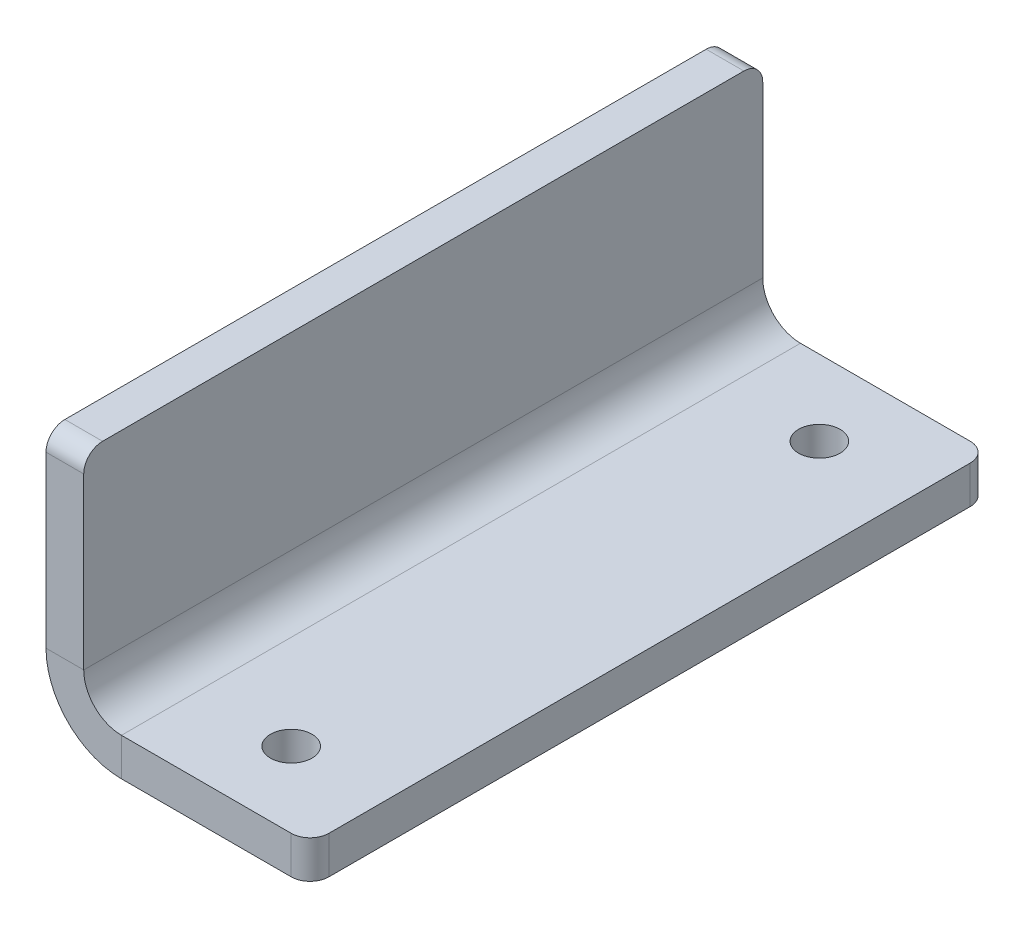
ISO-10303-21;
HEADER;
FILE_DESCRIPTION(('STEP AP214'),'2;1');
FILE_NAME('part.step','',(''),(''),'','','');
FILE_SCHEMA(('AUTOMOTIVE_DESIGN { 1 0 10303 214 1 1 1 1 }'));
ENDSEC;
DATA;
#1=APPLICATION_CONTEXT('core data for automotive mechanical design processes');
#2=APPLICATION_PROTOCOL_DEFINITION('international standard','automotive_design',2000,#1);
#3=PRODUCT_CONTEXT('',#1,'mechanical');
#4=PRODUCT('Part','Part','',(#3));
#5=PRODUCT_RELATED_PRODUCT_CATEGORY('part','',(#4));
#6=PRODUCT_DEFINITION_FORMATION('','',#4);
#7=PRODUCT_DEFINITION_CONTEXT('part definition',#1,'design');
#8=PRODUCT_DEFINITION('design','',#6,#7);
#9=PRODUCT_DEFINITION_SHAPE('','',#8);
#10=(LENGTH_UNIT() NAMED_UNIT(*) SI_UNIT(.MILLI.,.METRE.));
#11=(NAMED_UNIT(*) PLANE_ANGLE_UNIT() SI_UNIT($,.RADIAN.));
#12=(NAMED_UNIT(*) SI_UNIT($,.STERADIAN.) SOLID_ANGLE_UNIT());
#13=UNCERTAINTY_MEASURE_WITH_UNIT(LENGTH_MEASURE(1.E-05),#10,'distance_accuracy_value','');
#14=(GEOMETRIC_REPRESENTATION_CONTEXT(3) GLOBAL_UNCERTAINTY_ASSIGNED_CONTEXT((#13)) GLOBAL_UNIT_ASSIGNED_CONTEXT((#10,
#11,#12)) REPRESENTATION_CONTEXT('',''));
#15=CARTESIAN_POINT('',(0.,0.,0.));
#16=DIRECTION('',(0.,0.,1.));
#17=DIRECTION('',(1.,0.,0.));
#18=AXIS2_PLACEMENT_3D('',#15,#16,#17);
#19=CARTESIAN_POINT('',(10.,0.,180.));
#20=DIRECTION('',(0.,0.,1.));
#21=DIRECTION('',(1.,0.,0.));
#22=AXIS2_PLACEMENT_3D('',#19,#20,#21);
#23=PLANE('',#22);
#24=DIRECTION('',(0.,-1.,0.));
#25=VECTOR('',#24,1.);
#26=CARTESIAN_POINT('',(10.,0.,180.));
#27=LINE('',#26,#25);
#28=CARTESIAN_POINT('',(10.,0.,180.));
#29=VERTEX_POINT('',#28);
#30=CARTESIAN_POINT('',(10.,-10.,180.));
#31=VERTEX_POINT('',#30);
#32=EDGE_CURVE('E136',#29,#31,#27,.T.);
#33=ORIENTED_EDGE('',*,*,#32,.F.);
#34=CARTESIAN_POINT('',(10.,10.,180.));
#35=DIRECTION('',(0.,0.,-1.));
#36=DIRECTION('',(-1.,0.,0.));
#37=AXIS2_PLACEMENT_3D('',#34,#35,#36);
#38=CIRCLE('',#37,10.);
#39=CARTESIAN_POINT('',(0.,10.,180.));
#40=VERTEX_POINT('',#39);
#41=EDGE_CURVE('E140',#40,#29,#38,.F.);
#42=ORIENTED_EDGE('',*,*,#41,.F.);
#43=DIRECTION('',(1.,0.,0.));
#44=VECTOR('',#43,1.);
#45=CARTESIAN_POINT('',(-10.,10.,180.));
#46=LINE('',#45,#44);
#47=CARTESIAN_POINT('',(-10.,10.,180.));
#48=VERTEX_POINT('',#47);
#49=EDGE_CURVE('E146',#48,#40,#46,.T.);
#50=ORIENTED_EDGE('',*,*,#49,.F.);
#51=CARTESIAN_POINT('',(10.,10.,180.));
#52=DIRECTION('',(0.,0.,1.));
#53=DIRECTION('',(1.,0.,0.));
#54=AXIS2_PLACEMENT_3D('',#51,#52,#53);
#55=CIRCLE('',#54,20.);
#56=EDGE_CURVE('E142',#48,#31,#55,.T.);
#57=ORIENTED_EDGE('',*,*,#56,.T.);
#58=EDGE_LOOP('',(#33,#42,#50,#57));
#59=FACE_BOUND('',#58,.T.);
#60=ADVANCED_FACE('F40',(#59),#23,.T.);
#61=CARTESIAN_POINT('',(-10.,10.,180.));
#62=DIRECTION('',(0.,0.,1.));
#63=DIRECTION('',(1.,0.,0.));
#64=AXIS2_PLACEMENT_3D('',#61,#62,#63);
#65=PLANE('',#64);
#66=DIRECTION('',(1.,0.,0.));
#67=VECTOR('',#66,1.);
#68=CARTESIAN_POINT('',(0.,-10.,180.));
#69=LINE('',#68,#67);
#70=CARTESIAN_POINT('',(55.,-10.,180.));
#71=VERTEX_POINT('',#70);
#72=EDGE_CURVE('E163',#31,#71,#69,.T.);
#73=ORIENTED_EDGE('',*,*,#72,.T.);
#74=DIRECTION('',(0.,-1.,0.));
#75=VECTOR('',#74,1.);
#76=CARTESIAN_POINT('',(55.,10.,180.));
#77=LINE('',#76,#75);
#78=CARTESIAN_POINT('',(55.,0.,180.));
#79=VERTEX_POINT('',#78);
#80=EDGE_CURVE('E66',#71,#79,#77,.F.);
#81=ORIENTED_EDGE('',*,*,#80,.T.);
#82=DIRECTION('',(1.,0.,0.));
#83=VECTOR('',#82,1.);
#84=CARTESIAN_POINT('',(0.,0.,180.));
#85=LINE('',#84,#83);
#86=EDGE_CURVE('E151',#29,#79,#85,.T.);
#87=ORIENTED_EDGE('',*,*,#86,.F.);
#88=ORIENTED_EDGE('',*,*,#32,.T.);
#89=EDGE_LOOP('',(#73,#81,#87,#88));
#90=FACE_BOUND('',#89,.T.);
#91=ADVANCED_FACE('F161',(#90),#65,.T.);
#92=CARTESIAN_POINT('',(0.,10.,0.));
#93=DIRECTION('',(0.,0.,-1.));
#94=DIRECTION('',(-1.,0.,0.));
#95=AXIS2_PLACEMENT_3D('',#92,#93,#94);
#96=PLANE('',#95);
#97=DIRECTION('',(-1.,0.,0.));
#98=VECTOR('',#97,1.);
#99=CARTESIAN_POINT('',(0.,10.,0.));
#100=LINE('',#99,#98);
#101=CARTESIAN_POINT('',(0.,10.,0.));
#102=VERTEX_POINT('',#101);
#103=CARTESIAN_POINT('',(-10.,10.,0.));
#104=VERTEX_POINT('',#103);
#105=EDGE_CURVE('E227',#102,#104,#100,.T.);
#106=ORIENTED_EDGE('',*,*,#105,.F.);
#107=CARTESIAN_POINT('',(10.,10.,0.));
#108=DIRECTION('',(0.,0.,-1.));
#109=DIRECTION('',(-1.,0.,0.));
#110=AXIS2_PLACEMENT_3D('',#107,#108,#109);
#111=CIRCLE('',#110,10.);
#112=CARTESIAN_POINT('',(10.,0.,0.));
#113=VERTEX_POINT('',#112);
#114=EDGE_CURVE('E188',#102,#113,#111,.F.);
#115=ORIENTED_EDGE('',*,*,#114,.T.);
#116=DIRECTION('',(0.,1.,0.));
#117=VECTOR('',#116,1.);
#118=CARTESIAN_POINT('',(10.,-10.,0.));
#119=LINE('',#118,#117);
#120=CARTESIAN_POINT('',(10.,-10.,0.));
#121=VERTEX_POINT('',#120);
#122=EDGE_CURVE('E224',#121,#113,#119,.T.);
#123=ORIENTED_EDGE('',*,*,#122,.F.);
#124=CARTESIAN_POINT('',(10.,10.,0.));
#125=DIRECTION('',(0.,0.,1.));
#126=DIRECTION('',(1.,0.,0.));
#127=AXIS2_PLACEMENT_3D('',#124,#125,#126);
#128=CIRCLE('',#127,20.);
#129=EDGE_CURVE('E197',#104,#121,#128,.T.);
#130=ORIENTED_EDGE('',*,*,#129,.F.);
#131=EDGE_LOOP('',(#106,#115,#123,#130));
#132=FACE_BOUND('',#131,.T.);
#133=ADVANCED_FACE('F320',(#132),#96,.T.);
#134=CARTESIAN_POINT('',(10.,-10.,0.));
#135=DIRECTION('',(0.,0.,-1.));
#136=DIRECTION('',(-1.,0.,0.));
#137=AXIS2_PLACEMENT_3D('',#134,#135,#136);
#138=PLANE('',#137);
#139=DIRECTION('',(0.,1.,0.));
#140=VECTOR('',#139,1.);
#141=CARTESIAN_POINT('',(-10.,0.,0.));
#142=LINE('',#141,#140);
#143=CARTESIAN_POINT('',(-10.,55.,0.));
#144=VERTEX_POINT('',#143);
#145=EDGE_CURVE('E194',#144,#104,#142,.F.);
#146=ORIENTED_EDGE('',*,*,#145,.F.);
#147=DIRECTION('',(1.,0.,0.));
#148=VECTOR('',#147,1.);
#149=CARTESIAN_POINT('',(10.,55.,0.));
#150=LINE('',#149,#148);
#151=CARTESIAN_POINT('',(0.,55.,0.));
#152=VERTEX_POINT('',#151);
#153=EDGE_CURVE('E145',#144,#152,#150,.T.);
#154=ORIENTED_EDGE('',*,*,#153,.T.);
#155=DIRECTION('',(0.,-1.,0.));
#156=VECTOR('',#155,1.);
#157=CARTESIAN_POINT('',(0.,0.,0.));
#158=LINE('',#157,#156);
#159=EDGE_CURVE('E191',#152,#102,#158,.T.);
#160=ORIENTED_EDGE('',*,*,#159,.T.);
#161=ORIENTED_EDGE('',*,*,#105,.T.);
#162=EDGE_LOOP('',(#146,#154,#160,#161));
#163=FACE_BOUND('',#162,.T.);
#164=ADVANCED_FACE('F337',(#163),#138,.T.);
#165=CARTESIAN_POINT('',(0.,-10.,180.));
#166=DIRECTION('',(0.,1.,0.));
#167=DIRECTION('',(0.,0.,1.));
#168=AXIS2_PLACEMENT_3D('',#165,#166,#167);
#169=PLANE('',#168);
#170=CARTESIAN_POINT('',(35.,-10.,160.));
#171=DIRECTION('',(0.,-1.,0.));
#172=DIRECTION('',(0.,0.,-1.));
#173=AXIS2_PLACEMENT_3D('',#170,#171,#172);
#174=CIRCLE('',#173,5.5);
#175=CARTESIAN_POINT('',(35.,-10.,154.5));
#176=VERTEX_POINT('',#175);
#177=EDGE_CURVE('E280',#176,#176,#174,.T.);
#178=ORIENTED_EDGE('',*,*,#177,.F.);
#179=EDGE_LOOP('',(#178));
#180=FACE_BOUND('',#179,.T.);
#181=CARTESIAN_POINT('',(35.,-10.,20.));
#182=DIRECTION('',(0.,-1.,0.));
#183=DIRECTION('',(0.,0.,-1.));
#184=AXIS2_PLACEMENT_3D('',#181,#182,#183);
#185=CIRCLE('',#184,5.5);
#186=CARTESIAN_POINT('',(35.,-10.,14.5));
#187=VERTEX_POINT('',#186);
#188=EDGE_CURVE('E288',#187,#187,#185,.T.);
#189=ORIENTED_EDGE('',*,*,#188,.F.);
#190=EDGE_LOOP('',(#189));
#191=FACE_BOUND('',#190,.T.);
#192=DIRECTION('',(0.,0.,-1.));
#193=VECTOR('',#192,1.);
#194=CARTESIAN_POINT('',(60.,-10.,180.));
#195=LINE('',#194,#193);
#196=CARTESIAN_POINT('',(60.,-10.,175.));
#197=VERTEX_POINT('',#196);
#198=CARTESIAN_POINT('',(60.,-10.,5.00000000000006));
#199=VERTEX_POINT('',#198);
#200=EDGE_CURVE('E220',#197,#199,#195,.T.);
#201=ORIENTED_EDGE('',*,*,#200,.F.);
#202=CARTESIAN_POINT('',(55.,-10.,175.));
#203=DIRECTION('',(0.,1.,0.));
#204=DIRECTION('',(0.,0.,1.));
#205=AXIS2_PLACEMENT_3D('',#202,#203,#204);
#206=CIRCLE('',#205,5.);
#207=EDGE_CURVE('E269',#197,#71,#206,.F.);
#208=ORIENTED_EDGE('',*,*,#207,.T.);
#209=ORIENTED_EDGE('',*,*,#72,.F.);
#210=DIRECTION('',(0.,0.,-1.));
#211=VECTOR('',#210,1.);
#212=CARTESIAN_POINT('',(10.,-10.,180.));
#213=LINE('',#212,#211);
#214=EDGE_CURVE('E181',#31,#121,#213,.T.);
#215=ORIENTED_EDGE('',*,*,#214,.T.);
#216=DIRECTION('',(1.,0.,0.));
#217=VECTOR('',#216,1.);
#218=CARTESIAN_POINT('',(0.,-10.,0.));
#219=LINE('',#218,#217);
#220=CARTESIAN_POINT('',(55.,-10.,0.));
#221=VERTEX_POINT('',#220);
#222=EDGE_CURVE('E182',#121,#221,#219,.T.);
#223=ORIENTED_EDGE('',*,*,#222,.T.);
#224=CARTESIAN_POINT('',(55.,-10.,5.));
#225=DIRECTION('',(0.,1.,0.));
#226=DIRECTION('',(0.,0.,1.));
#227=AXIS2_PLACEMENT_3D('',#224,#225,#226);
#228=CIRCLE('',#227,5.);
#229=EDGE_CURVE('E266',#221,#199,#228,.F.);
#230=ORIENTED_EDGE('',*,*,#229,.T.);
#231=EDGE_LOOP('',(#201,#208,#209,#215,#223,#230));
#232=FACE_BOUND('',#231,.T.);
#233=ADVANCED_FACE('F313',(#180,#191,#232),#169,.F.);
#234=CARTESIAN_POINT('',(60.,0.,180.));
#235=DIRECTION('',(1.,0.,0.));
#236=DIRECTION('',(0.,0.,-1.));
#237=AXIS2_PLACEMENT_3D('',#234,#235,#236);
#238=PLANE('',#237);
#239=DIRECTION('',(0.,0.,-1.));
#240=VECTOR('',#239,1.);
#241=CARTESIAN_POINT('',(60.,0.,180.));
#242=LINE('',#241,#240);
#243=CARTESIAN_POINT('',(60.,0.,175.));
#244=VERTEX_POINT('',#243);
#245=CARTESIAN_POINT('',(60.,0.,5.00000000000006));
#246=VERTEX_POINT('',#245);
#247=EDGE_CURVE('E158',#244,#246,#242,.T.);
#248=ORIENTED_EDGE('',*,*,#247,.F.);
#249=DIRECTION('',(0.,-1.,0.));
#250=VECTOR('',#249,1.);
#251=CARTESIAN_POINT('',(60.,0.,175.));
#252=LINE('',#251,#250);
#253=EDGE_CURVE('E262',#244,#197,#252,.T.);
#254=ORIENTED_EDGE('',*,*,#253,.T.);
#255=ORIENTED_EDGE('',*,*,#200,.T.);
#256=DIRECTION('',(0.,-1.,0.));
#257=VECTOR('',#256,1.);
#258=CARTESIAN_POINT('',(60.,0.,5.));
#259=LINE('',#258,#257);
#260=EDGE_CURVE('E259',#199,#246,#259,.F.);
#261=ORIENTED_EDGE('',*,*,#260,.T.);
#262=EDGE_LOOP('',(#248,#254,#255,#261));
#263=FACE_BOUND('',#262,.T.);
#264=ADVANCED_FACE('F305',(#263),#238,.T.);
#265=CARTESIAN_POINT('',(0.,0.,180.));
#266=DIRECTION('',(0.,1.,0.));
#267=DIRECTION('',(0.,0.,1.));
#268=AXIS2_PLACEMENT_3D('',#265,#266,#267);
#269=PLANE('',#268);
#270=CARTESIAN_POINT('',(35.,0.,160.));
#271=DIRECTION('',(0.,1.,0.));
#272=DIRECTION('',(0.,0.,1.));
#273=AXIS2_PLACEMENT_3D('',#270,#271,#272);
#274=CIRCLE('',#273,5.5);
#275=CARTESIAN_POINT('',(35.,0.,165.5));
#276=VERTEX_POINT('',#275);
#277=EDGE_CURVE('E44',#276,#276,#274,.T.);
#278=ORIENTED_EDGE('',*,*,#277,.F.);
#279=EDGE_LOOP('',(#278));
#280=FACE_BOUND('',#279,.T.);
#281=CARTESIAN_POINT('',(35.,0.,20.));
#282=DIRECTION('',(0.,1.,0.));
#283=DIRECTION('',(0.,0.,1.));
#284=AXIS2_PLACEMENT_3D('',#281,#282,#283);
#285=CIRCLE('',#284,5.5);
#286=CARTESIAN_POINT('',(35.,0.,25.5));
#287=VERTEX_POINT('',#286);
#288=EDGE_CURVE('E277',#287,#287,#285,.T.);
#289=ORIENTED_EDGE('',*,*,#288,.F.);
#290=EDGE_LOOP('',(#289));
#291=FACE_BOUND('',#290,.T.);
#292=ORIENTED_EDGE('',*,*,#86,.T.);
#293=CARTESIAN_POINT('',(55.,0.,175.));
#294=DIRECTION('',(0.,1.,0.));
#295=DIRECTION('',(0.,0.,1.));
#296=AXIS2_PLACEMENT_3D('',#293,#294,#295);
#297=CIRCLE('',#296,5.);
#298=EDGE_CURVE('E50',#79,#244,#297,.T.);
#299=ORIENTED_EDGE('',*,*,#298,.T.);
#300=ORIENTED_EDGE('',*,*,#247,.T.);
#301=CARTESIAN_POINT('',(55.,0.,5.));
#302=DIRECTION('',(0.,1.,0.));
#303=DIRECTION('',(0.,0.,1.));
#304=AXIS2_PLACEMENT_3D('',#301,#302,#303);
#305=CIRCLE('',#304,5.);
#306=CARTESIAN_POINT('',(55.,0.,0.));
#307=VERTEX_POINT('',#306);
#308=EDGE_CURVE('E58',#246,#307,#305,.T.);
#309=ORIENTED_EDGE('',*,*,#308,.T.);
#310=DIRECTION('',(1.,0.,0.));
#311=VECTOR('',#310,1.);
#312=CARTESIAN_POINT('',(0.,0.,0.));
#313=LINE('',#312,#311);
#314=EDGE_CURVE('E153',#113,#307,#313,.T.);
#315=ORIENTED_EDGE('',*,*,#314,.F.);
#316=DIRECTION('',(0.,0.,-1.));
#317=VECTOR('',#316,1.);
#318=CARTESIAN_POINT('',(10.,0.,180.));
#319=LINE('',#318,#317);
#320=EDGE_CURVE('E149',#29,#113,#319,.T.);
#321=ORIENTED_EDGE('',*,*,#320,.F.);
#322=EDGE_LOOP('',(#292,#299,#300,#309,#315,#321));
#323=FACE_BOUND('',#322,.T.);
#324=ADVANCED_FACE('F150',(#280,#291,#323),#269,.T.);
#325=CARTESIAN_POINT('',(10.,10.,180.));
#326=DIRECTION('',(0.,0.,-1.));
#327=DIRECTION('',(-1.,0.,0.));
#328=AXIS2_PLACEMENT_3D('',#325,#326,#327);
#329=CYLINDRICAL_SURFACE('',#328,10.);
#330=ORIENTED_EDGE('',*,*,#114,.F.);
#331=DIRECTION('',(0.,0.,-1.));
#332=VECTOR('',#331,1.);
#333=CARTESIAN_POINT('',(0.,10.,180.));
#334=LINE('',#333,#332);
#335=EDGE_CURVE('E159',#40,#102,#334,.T.);
#336=ORIENTED_EDGE('',*,*,#335,.F.);
#337=ORIENTED_EDGE('',*,*,#41,.T.);
#338=ORIENTED_EDGE('',*,*,#320,.T.);
#339=EDGE_LOOP('',(#330,#336,#337,#338));
#340=FACE_BOUND('',#339,.T.);
#341=ADVANCED_FACE('F166',(#340),#329,.F.);
#342=CARTESIAN_POINT('',(0.,0.,180.));
#343=DIRECTION('',(1.,0.,0.));
#344=DIRECTION('',(0.,0.,-1.));
#345=AXIS2_PLACEMENT_3D('',#342,#343,#344);
#346=PLANE('',#345);
#347=ORIENTED_EDGE('',*,*,#159,.F.);
#348=CARTESIAN_POINT('',(0.,55.,5.));
#349=DIRECTION('',(1.,0.,0.));
#350=DIRECTION('',(0.,0.,-1.));
#351=AXIS2_PLACEMENT_3D('',#348,#349,#350);
#352=CIRCLE('',#351,5.);
#353=CARTESIAN_POINT('',(0.,60.,5.00000000000006));
#354=VERTEX_POINT('',#353);
#355=EDGE_CURVE('E240',#152,#354,#352,.T.);
#356=ORIENTED_EDGE('',*,*,#355,.T.);
#357=DIRECTION('',(0.,0.,-1.));
#358=VECTOR('',#357,1.);
#359=CARTESIAN_POINT('',(0.,60.,180.));
#360=LINE('',#359,#358);
#361=CARTESIAN_POINT('',(0.,60.,175.));
#362=VERTEX_POINT('',#361);
#363=EDGE_CURVE('E212',#362,#354,#360,.T.);
#364=ORIENTED_EDGE('',*,*,#363,.F.);
#365=CARTESIAN_POINT('',(0.,55.,175.));
#366=DIRECTION('',(1.,0.,0.));
#367=DIRECTION('',(0.,0.,-1.));
#368=AXIS2_PLACEMENT_3D('',#365,#366,#367);
#369=CIRCLE('',#368,5.);
#370=CARTESIAN_POINT('',(0.,55.,180.));
#371=VERTEX_POINT('',#370);
#372=EDGE_CURVE('E237',#362,#371,#369,.T.);
#373=ORIENTED_EDGE('',*,*,#372,.T.);
#374=DIRECTION('',(0.,-1.,0.));
#375=VECTOR('',#374,1.);
#376=CARTESIAN_POINT('',(0.,0.,180.));
#377=LINE('',#376,#375);
#378=EDGE_CURVE('E169',#371,#40,#377,.T.);
#379=ORIENTED_EDGE('',*,*,#378,.T.);
#380=ORIENTED_EDGE('',*,*,#335,.T.);
#381=EDGE_LOOP('',(#347,#356,#364,#373,#379,#380));
#382=FACE_BOUND('',#381,.T.);
#383=ADVANCED_FACE('F325',(#382),#346,.T.);
#384=CARTESIAN_POINT('',(-10.,60.,180.));
#385=DIRECTION('',(0.,1.,0.));
#386=DIRECTION('',(0.,0.,1.));
#387=AXIS2_PLACEMENT_3D('',#384,#385,#386);
#388=PLANE('',#387);
#389=ORIENTED_EDGE('',*,*,#363,.T.);
#390=DIRECTION('',(1.,0.,0.));
#391=VECTOR('',#390,1.);
#392=CARTESIAN_POINT('',(-10.,60.,5.));
#393=LINE('',#392,#391);
#394=CARTESIAN_POINT('',(-10.,60.,5.00000000000006));
#395=VERTEX_POINT('',#394);
#396=EDGE_CURVE('E247',#354,#395,#393,.F.);
#397=ORIENTED_EDGE('',*,*,#396,.T.);
#398=DIRECTION('',(0.,0.,-1.));
#399=VECTOR('',#398,1.);
#400=CARTESIAN_POINT('',(-10.,60.,180.));
#401=LINE('',#400,#399);
#402=CARTESIAN_POINT('',(-10.,60.,175.));
#403=VERTEX_POINT('',#402);
#404=EDGE_CURVE('E208',#403,#395,#401,.T.);
#405=ORIENTED_EDGE('',*,*,#404,.F.);
#406=DIRECTION('',(1.,0.,0.));
#407=VECTOR('',#406,1.);
#408=CARTESIAN_POINT('',(0.,60.,175.));
#409=LINE('',#408,#407);
#410=EDGE_CURVE('E243',#403,#362,#409,.T.);
#411=ORIENTED_EDGE('',*,*,#410,.T.);
#412=EDGE_LOOP('',(#389,#397,#405,#411));
#413=FACE_BOUND('',#412,.T.);
#414=ADVANCED_FACE('F342',(#413),#388,.T.);
#415=CARTESIAN_POINT('',(-10.,0.,180.));
#416=DIRECTION('',(1.,0.,0.));
#417=DIRECTION('',(0.,0.,-1.));
#418=AXIS2_PLACEMENT_3D('',#415,#416,#417);
#419=PLANE('',#418);
#420=ORIENTED_EDGE('',*,*,#404,.T.);
#421=CARTESIAN_POINT('',(-10.,55.,5.));
#422=DIRECTION('',(1.,0.,0.));
#423=DIRECTION('',(0.,0.,-1.));
#424=AXIS2_PLACEMENT_3D('',#421,#422,#423);
#425=CIRCLE('',#424,5.);
#426=EDGE_CURVE('E253',#395,#144,#425,.F.);
#427=ORIENTED_EDGE('',*,*,#426,.T.);
#428=ORIENTED_EDGE('',*,*,#145,.T.);
#429=DIRECTION('',(0.,0.,-1.));
#430=VECTOR('',#429,1.);
#431=CARTESIAN_POINT('',(-10.,10.,180.));
#432=LINE('',#431,#430);
#433=EDGE_CURVE('E204',#48,#104,#432,.T.);
#434=ORIENTED_EDGE('',*,*,#433,.F.);
#435=DIRECTION('',(0.,1.,0.));
#436=VECTOR('',#435,1.);
#437=CARTESIAN_POINT('',(-10.,0.,180.));
#438=LINE('',#437,#436);
#439=CARTESIAN_POINT('',(-10.,55.,180.));
#440=VERTEX_POINT('',#439);
#441=EDGE_CURVE('E173',#440,#48,#438,.F.);
#442=ORIENTED_EDGE('',*,*,#441,.F.);
#443=CARTESIAN_POINT('',(-10.,55.,175.));
#444=DIRECTION('',(1.,0.,0.));
#445=DIRECTION('',(0.,0.,-1.));
#446=AXIS2_PLACEMENT_3D('',#443,#444,#445);
#447=CIRCLE('',#446,5.);
#448=EDGE_CURVE('E250',#440,#403,#447,.F.);
#449=ORIENTED_EDGE('',*,*,#448,.T.);
#450=EDGE_LOOP('',(#420,#427,#428,#434,#442,#449));
#451=FACE_BOUND('',#450,.T.);
#452=ADVANCED_FACE('F333',(#451),#419,.F.);
#453=CARTESIAN_POINT('',(10.,10.,180.));
#454=DIRECTION('',(0.,0.,-1.));
#455=DIRECTION('',(-1.,0.,0.));
#456=AXIS2_PLACEMENT_3D('',#453,#454,#455);
#457=CYLINDRICAL_SURFACE('',#456,20.);
#458=ORIENTED_EDGE('',*,*,#129,.T.);
#459=ORIENTED_EDGE('',*,*,#214,.F.);
#460=ORIENTED_EDGE('',*,*,#56,.F.);
#461=ORIENTED_EDGE('',*,*,#433,.T.);
#462=EDGE_LOOP('',(#458,#459,#460,#461));
#463=FACE_BOUND('',#462,.T.);
#464=ADVANCED_FACE('F315',(#463),#457,.T.);
#465=CARTESIAN_POINT('',(10.,10.,180.));
#466=DIRECTION('',(0.,0.,-1.));
#467=DIRECTION('',(-1.,0.,0.));
#468=AXIS2_PLACEMENT_3D('',#465,#466,#467);
#469=PLANE('',#468);
#470=ORIENTED_EDGE('',*,*,#378,.F.);
#471=DIRECTION('',(1.,0.,0.));
#472=VECTOR('',#471,1.);
#473=CARTESIAN_POINT('',(-10.,55.,180.));
#474=LINE('',#473,#472);
#475=EDGE_CURVE('E256',#371,#440,#474,.F.);
#476=ORIENTED_EDGE('',*,*,#475,.T.);
#477=ORIENTED_EDGE('',*,*,#441,.T.);
#478=ORIENTED_EDGE('',*,*,#49,.T.);
#479=EDGE_LOOP('',(#470,#476,#477,#478));
#480=FACE_BOUND('',#479,.T.);
#481=ADVANCED_FACE('F330',(#480),#469,.F.);
#482=CARTESIAN_POINT('',(10.,10.,0.));
#483=DIRECTION('',(0.,0.,-1.));
#484=DIRECTION('',(-1.,0.,0.));
#485=AXIS2_PLACEMENT_3D('',#482,#483,#484);
#486=PLANE('',#485);
#487=ORIENTED_EDGE('',*,*,#314,.T.);
#488=DIRECTION('',(0.,-1.,0.));
#489=VECTOR('',#488,1.);
#490=CARTESIAN_POINT('',(55.,10.,0.));
#491=LINE('',#490,#489);
#492=EDGE_CURVE('E11',#307,#221,#491,.T.);
#493=ORIENTED_EDGE('',*,*,#492,.T.);
#494=ORIENTED_EDGE('',*,*,#222,.F.);
#495=ORIENTED_EDGE('',*,*,#122,.T.);
#496=EDGE_LOOP('',(#487,#493,#494,#495));
#497=FACE_BOUND('',#496,.T.);
#498=ADVANCED_FACE('F312',(#497),#486,.T.);
#499=CARTESIAN_POINT('',(10.,55.,5.));
#500=DIRECTION('',(1.,0.,0.));
#501=DIRECTION('',(0.,0.,-1.));
#502=AXIS2_PLACEMENT_3D('',#499,#500,#501);
#503=CYLINDRICAL_SURFACE('',#502,5.);
#504=ORIENTED_EDGE('',*,*,#426,.F.);
#505=ORIENTED_EDGE('',*,*,#396,.F.);
#506=ORIENTED_EDGE('',*,*,#355,.F.);
#507=ORIENTED_EDGE('',*,*,#153,.F.);
#508=EDGE_LOOP('',(#504,#505,#506,#507));
#509=FACE_BOUND('',#508,.T.);
#510=ADVANCED_FACE('F339',(#509),#503,.T.);
#511=CARTESIAN_POINT('',(-10.,55.,175.));
#512=DIRECTION('',(-1.,0.,0.));
#513=DIRECTION('',(0.,0.,1.));
#514=AXIS2_PLACEMENT_3D('',#511,#512,#513);
#515=CYLINDRICAL_SURFACE('',#514,5.);
#516=ORIENTED_EDGE('',*,*,#448,.F.);
#517=ORIENTED_EDGE('',*,*,#475,.F.);
#518=ORIENTED_EDGE('',*,*,#372,.F.);
#519=ORIENTED_EDGE('',*,*,#410,.F.);
#520=EDGE_LOOP('',(#516,#517,#518,#519));
#521=FACE_BOUND('',#520,.T.);
#522=ADVANCED_FACE('F346',(#521),#515,.T.);
#523=CARTESIAN_POINT('',(55.,0.,175.));
#524=DIRECTION('',(0.,-1.,0.));
#525=DIRECTION('',(0.,0.,-1.));
#526=AXIS2_PLACEMENT_3D('',#523,#524,#525);
#527=CYLINDRICAL_SURFACE('',#526,5.);
#528=ORIENTED_EDGE('',*,*,#298,.F.);
#529=ORIENTED_EDGE('',*,*,#80,.F.);
#530=ORIENTED_EDGE('',*,*,#207,.F.);
#531=ORIENTED_EDGE('',*,*,#253,.F.);
#532=EDGE_LOOP('',(#528,#529,#530,#531));
#533=FACE_BOUND('',#532,.T.);
#534=ADVANCED_FACE('F301',(#533),#527,.T.);
#535=CARTESIAN_POINT('',(55.,10.,5.));
#536=DIRECTION('',(0.,-1.,0.));
#537=DIRECTION('',(0.,0.,-1.));
#538=AXIS2_PLACEMENT_3D('',#535,#536,#537);
#539=CYLINDRICAL_SURFACE('',#538,5.);
#540=ORIENTED_EDGE('',*,*,#308,.F.);
#541=ORIENTED_EDGE('',*,*,#260,.F.);
#542=ORIENTED_EDGE('',*,*,#229,.F.);
#543=ORIENTED_EDGE('',*,*,#492,.F.);
#544=EDGE_LOOP('',(#540,#541,#542,#543));
#545=FACE_BOUND('',#544,.T.);
#546=ADVANCED_FACE('F42',(#545),#539,.T.);
#547=CARTESIAN_POINT('',(35.,10.,20.));
#548=DIRECTION('',(0.,-1.,0.));
#549=DIRECTION('',(0.,0.,-1.));
#550=AXIS2_PLACEMENT_3D('',#547,#548,#549);
#551=CYLINDRICAL_SURFACE('',#550,5.5);
#552=ORIENTED_EDGE('',*,*,#288,.T.);
#553=EDGE_LOOP('',(#552));
#554=FACE_BOUND('',#553,.T.);
#555=ORIENTED_EDGE('',*,*,#188,.T.);
#556=EDGE_LOOP('',(#555));
#557=FACE_BOUND('',#556,.T.);
#558=ADVANCED_FACE('F387',(#554,#557),#551,.F.);
#559=CARTESIAN_POINT('',(35.,10.,160.));
#560=DIRECTION('',(0.,-1.,0.));
#561=DIRECTION('',(0.,0.,-1.));
#562=AXIS2_PLACEMENT_3D('',#559,#560,#561);
#563=CYLINDRICAL_SURFACE('',#562,5.5);
#564=ORIENTED_EDGE('',*,*,#277,.T.);
#565=EDGE_LOOP('',(#564));
#566=FACE_BOUND('',#565,.T.);
#567=ORIENTED_EDGE('',*,*,#177,.T.);
#568=EDGE_LOOP('',(#567));
#569=FACE_BOUND('',#568,.T.);
#570=ADVANCED_FACE('F390',(#566,#569),#563,.F.);
#571=CLOSED_SHELL('',(#60,#91,#133,#164,#233,#264,#324,#341,#383,#414,#452,#464,#481,#498,#510,
#522,#534,#546,#558,#570));
#572=MANIFOLD_SOLID_BREP('B2',#571);
#573=ADVANCED_BREP_SHAPE_REPRESENTATION('',(#18,#572),#14);
#574=SHAPE_DEFINITION_REPRESENTATION(#9,#573);
ENDSEC;
END-ISO-10303-21;
